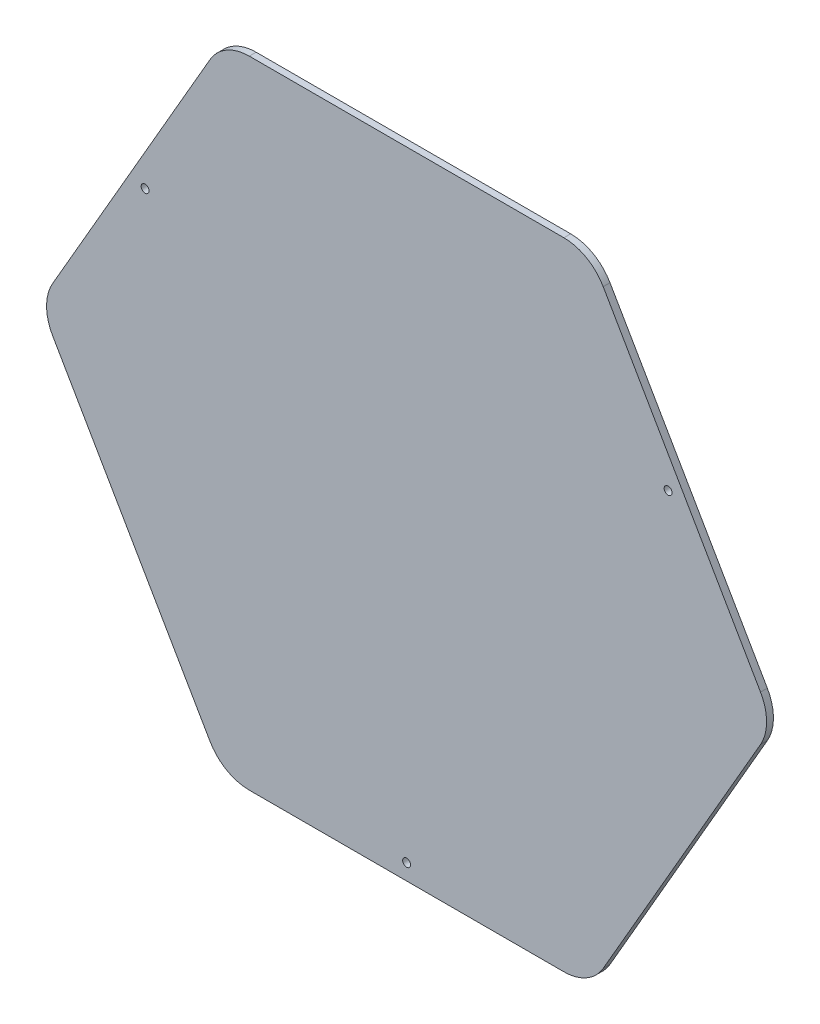
ISO-10303-21;
HEADER;
FILE_DESCRIPTION(('STEP AP214'),'2;1');
FILE_NAME('part.step','',(''),(''),'','','');
FILE_SCHEMA(('AUTOMOTIVE_DESIGN { 1 0 10303 214 1 1 1 1 }'));
ENDSEC;
DATA;
#1=APPLICATION_CONTEXT('core data for automotive mechanical design processes');
#2=APPLICATION_PROTOCOL_DEFINITION('international standard','automotive_design',2000,#1);
#3=PRODUCT_CONTEXT('',#1,'mechanical');
#4=PRODUCT('Part','Part','',(#3));
#5=PRODUCT_RELATED_PRODUCT_CATEGORY('part','',(#4));
#6=PRODUCT_DEFINITION_FORMATION('','',#4);
#7=PRODUCT_DEFINITION_CONTEXT('part definition',#1,'design');
#8=PRODUCT_DEFINITION('design','',#6,#7);
#9=PRODUCT_DEFINITION_SHAPE('','',#8);
#10=(LENGTH_UNIT() NAMED_UNIT(*) SI_UNIT(.MILLI.,.METRE.));
#11=(NAMED_UNIT(*) PLANE_ANGLE_UNIT() SI_UNIT($,.RADIAN.));
#12=(NAMED_UNIT(*) SI_UNIT($,.STERADIAN.) SOLID_ANGLE_UNIT());
#13=UNCERTAINTY_MEASURE_WITH_UNIT(LENGTH_MEASURE(1.E-05),#10,'distance_accuracy_value','');
#14=(GEOMETRIC_REPRESENTATION_CONTEXT(3) GLOBAL_UNCERTAINTY_ASSIGNED_CONTEXT((#13)) GLOBAL_UNIT_ASSIGNED_CONTEXT((#10,
#11,#12)) REPRESENTATION_CONTEXT('',''));
#15=CARTESIAN_POINT('',(0.,0.,0.));
#16=DIRECTION('',(0.,0.,1.));
#17=DIRECTION('',(1.,0.,0.));
#18=AXIS2_PLACEMENT_3D('',#15,#16,#17);
#19=CARTESIAN_POINT('',(0.,140.,3.));
#20=DIRECTION('',(0.,-1.,0.));
#21=DIRECTION('',(0.,0.,-1.));
#22=AXIS2_PLACEMENT_3D('',#19,#20,#21);
#23=PLANE('',#22);
#24=DIRECTION('',(-1.,0.,0.));
#25=VECTOR('',#24,1.);
#26=CARTESIAN_POINT('',(0.,140.,3.));
#27=LINE('',#26,#25);
#28=CARTESIAN_POINT('',(69.2820323027552,140.,3.));
#29=VERTEX_POINT('',#28);
#30=CARTESIAN_POINT('',(-69.2820323027552,140.,3.));
#31=VERTEX_POINT('',#30);
#32=EDGE_CURVE('E248',#29,#31,#27,.T.);
#33=ORIENTED_EDGE('',*,*,#32,.F.);
#34=DIRECTION('',(0.,0.,-1.));
#35=VECTOR('',#34,1.);
#36=CARTESIAN_POINT('',(69.2820323027552,140.,3.));
#37=LINE('',#36,#35);
#38=CARTESIAN_POINT('',(69.2820323027552,140.,0.));
#39=VERTEX_POINT('',#38);
#40=EDGE_CURVE('E231',#29,#39,#37,.T.);
#41=ORIENTED_EDGE('',*,*,#40,.T.);
#42=DIRECTION('',(-1.,0.,0.));
#43=VECTOR('',#42,1.);
#44=CARTESIAN_POINT('',(0.,140.,0.));
#45=LINE('',#44,#43);
#46=CARTESIAN_POINT('',(-69.2820323027552,140.,0.));
#47=VERTEX_POINT('',#46);
#48=EDGE_CURVE('E246',#39,#47,#45,.T.);
#49=ORIENTED_EDGE('',*,*,#48,.T.);
#50=DIRECTION('',(0.,0.,-1.));
#51=VECTOR('',#50,1.);
#52=CARTESIAN_POINT('',(-69.2820323027552,140.,3.));
#53=LINE('',#52,#51);
#54=EDGE_CURVE('E255',#47,#31,#53,.F.);
#55=ORIENTED_EDGE('',*,*,#54,.T.);
#56=EDGE_LOOP('',(#33,#41,#49,#55));
#57=FACE_BOUND('',#56,.T.);
#58=ADVANCED_FACE('F138',(#57),#23,.F.);
#59=CARTESIAN_POINT('',(-121.243556529821,70.,3.));
#60=DIRECTION('',(0.866025403784438,-0.5,0.));
#61=DIRECTION('',(0.5,0.866025403784439,0.));
#62=AXIS2_PLACEMENT_3D('',#59,#60,#61);
#63=PLANE('',#62);
#64=DIRECTION('',(-0.5,-0.866025403784439,0.));
#65=VECTOR('',#64,1.);
#66=CARTESIAN_POINT('',(-121.243556529821,70.,3.));
#67=LINE('',#66,#65);
#68=CARTESIAN_POINT('',(-86.6025403784439,130.,3.));
#69=VERTEX_POINT('',#68);
#70=CARTESIAN_POINT('',(-155.884572681199,10.0000000000001,3.));
#71=VERTEX_POINT('',#70);
#72=EDGE_CURVE('E350',#69,#71,#67,.T.);
#73=ORIENTED_EDGE('',*,*,#72,.F.);
#74=DIRECTION('',(0.,0.,-1.));
#75=VECTOR('',#74,1.);
#76=CARTESIAN_POINT('',(-86.6025403784439,130.,3.));
#77=LINE('',#76,#75);
#78=CARTESIAN_POINT('',(-86.6025403784439,130.,0.));
#79=VERTEX_POINT('',#78);
#80=EDGE_CURVE('E324',#69,#79,#77,.T.);
#81=ORIENTED_EDGE('',*,*,#80,.T.);
#82=DIRECTION('',(-0.5,-0.866025403784439,0.));
#83=VECTOR('',#82,1.);
#84=CARTESIAN_POINT('',(-121.243556529821,70.,0.));
#85=LINE('',#84,#83);
#86=CARTESIAN_POINT('',(-155.884572681199,10.0000000000001,0.));
#87=VERTEX_POINT('',#86);
#88=EDGE_CURVE('E256',#79,#87,#85,.T.);
#89=ORIENTED_EDGE('',*,*,#88,.T.);
#90=DIRECTION('',(0.,0.,-1.));
#91=VECTOR('',#90,1.);
#92=CARTESIAN_POINT('',(-155.884572681199,10.0000000000001,3.));
#93=LINE('',#92,#91);
#94=EDGE_CURVE('E319',#87,#71,#93,.F.);
#95=ORIENTED_EDGE('',*,*,#94,.T.);
#96=EDGE_LOOP('',(#73,#81,#89,#95));
#97=FACE_BOUND('',#96,.T.);
#98=ADVANCED_FACE('F417',(#97),#63,.F.);
#99=CARTESIAN_POINT('',(-121.243556529821,-70.,3.));
#100=DIRECTION('',(0.866025403784439,0.5,0.));
#101=DIRECTION('',(-0.5,0.866025403784439,0.));
#102=AXIS2_PLACEMENT_3D('',#99,#100,#101);
#103=PLANE('',#102);
#104=DIRECTION('',(0.5,-0.866025403784439,0.));
#105=VECTOR('',#104,1.);
#106=CARTESIAN_POINT('',(-121.243556529821,-70.,3.));
#107=LINE('',#106,#105);
#108=CARTESIAN_POINT('',(-155.884572681199,-9.99999999999993,3.));
#109=VERTEX_POINT('',#108);
#110=CARTESIAN_POINT('',(-86.6025403784439,-130.,3.));
#111=VERTEX_POINT('',#110);
#112=EDGE_CURVE('E345',#109,#111,#107,.T.);
#113=ORIENTED_EDGE('',*,*,#112,.F.);
#114=DIRECTION('',(0.,0.,-1.));
#115=VECTOR('',#114,1.);
#116=CARTESIAN_POINT('',(-155.884572681199,-9.99999999999995,3.));
#117=LINE('',#116,#115);
#118=CARTESIAN_POINT('',(-155.884572681199,-9.99999999999993,0.));
#119=VERTEX_POINT('',#118);
#120=EDGE_CURVE('E328',#109,#119,#117,.T.);
#121=ORIENTED_EDGE('',*,*,#120,.T.);
#122=DIRECTION('',(0.5,-0.866025403784439,0.));
#123=VECTOR('',#122,1.);
#124=CARTESIAN_POINT('',(-121.243556529821,-70.,0.));
#125=LINE('',#124,#123);
#126=CARTESIAN_POINT('',(-86.6025403784439,-130.,0.));
#127=VERTEX_POINT('',#126);
#128=EDGE_CURVE('E263',#119,#127,#125,.T.);
#129=ORIENTED_EDGE('',*,*,#128,.T.);
#130=DIRECTION('',(0.,0.,-1.));
#131=VECTOR('',#130,1.);
#132=CARTESIAN_POINT('',(-86.6025403784439,-130.,3.));
#133=LINE('',#132,#131);
#134=EDGE_CURVE('E322',#127,#111,#133,.F.);
#135=ORIENTED_EDGE('',*,*,#134,.T.);
#136=EDGE_LOOP('',(#113,#121,#129,#135));
#137=FACE_BOUND('',#136,.T.);
#138=ADVANCED_FACE('F423',(#137),#103,.F.);
#139=CARTESIAN_POINT('',(0.,-140.,3.));
#140=DIRECTION('',(0.,1.,0.));
#141=DIRECTION('',(-1.,0.,0.));
#142=AXIS2_PLACEMENT_3D('',#139,#140,#141);
#143=PLANE('',#142);
#144=DIRECTION('',(1.,0.,0.));
#145=VECTOR('',#144,1.);
#146=CARTESIAN_POINT('',(0.,-140.,3.));
#147=LINE('',#146,#145);
#148=CARTESIAN_POINT('',(-69.2820323027551,-140.,3.));
#149=VERTEX_POINT('',#148);
#150=CARTESIAN_POINT('',(69.2820323027551,-140.,3.));
#151=VERTEX_POINT('',#150);
#152=EDGE_CURVE('E344',#149,#151,#147,.T.);
#153=ORIENTED_EDGE('',*,*,#152,.F.);
#154=DIRECTION('',(0.,0.,-1.));
#155=VECTOR('',#154,1.);
#156=CARTESIAN_POINT('',(-69.2820323027551,-140.,3.));
#157=LINE('',#156,#155);
#158=CARTESIAN_POINT('',(-69.2820323027551,-140.,0.));
#159=VERTEX_POINT('',#158);
#160=EDGE_CURVE('E331',#149,#159,#157,.T.);
#161=ORIENTED_EDGE('',*,*,#160,.T.);
#162=DIRECTION('',(1.,0.,0.));
#163=VECTOR('',#162,1.);
#164=CARTESIAN_POINT('',(0.,-140.,0.));
#165=LINE('',#164,#163);
#166=CARTESIAN_POINT('',(69.2820323027551,-140.,0.));
#167=VERTEX_POINT('',#166);
#168=EDGE_CURVE('E275',#159,#167,#165,.T.);
#169=ORIENTED_EDGE('',*,*,#168,.T.);
#170=DIRECTION('',(0.,0.,-1.));
#171=VECTOR('',#170,1.);
#172=CARTESIAN_POINT('',(69.2820323027551,-140.,3.));
#173=LINE('',#172,#171);
#174=EDGE_CURVE('E335',#167,#151,#173,.F.);
#175=ORIENTED_EDGE('',*,*,#174,.T.);
#176=EDGE_LOOP('',(#153,#161,#169,#175));
#177=FACE_BOUND('',#176,.T.);
#178=ADVANCED_FACE('F458',(#177),#143,.F.);
#179=CARTESIAN_POINT('',(121.243556529821,-69.9999999999999,3.));
#180=DIRECTION('',(-0.866025403784439,0.5,0.));
#181=DIRECTION('',(-0.5,-0.866025403784439,0.));
#182=AXIS2_PLACEMENT_3D('',#179,#180,#181);
#183=PLANE('',#182);
#184=DIRECTION('',(0.5,0.866025403784439,0.));
#185=VECTOR('',#184,1.);
#186=CARTESIAN_POINT('',(121.243556529821,-69.9999999999999,3.));
#187=LINE('',#186,#185);
#188=CARTESIAN_POINT('',(86.6025403784438,-130.,3.));
#189=VERTEX_POINT('',#188);
#190=CARTESIAN_POINT('',(155.884572681199,-9.99999999999984,3.));
#191=VERTEX_POINT('',#190);
#192=EDGE_CURVE('E281',#189,#191,#187,.T.);
#193=ORIENTED_EDGE('',*,*,#192,.F.);
#194=DIRECTION('',(0.,0.,-1.));
#195=VECTOR('',#194,1.);
#196=CARTESIAN_POINT('',(86.6025403784438,-130.,3.));
#197=LINE('',#196,#195);
#198=CARTESIAN_POINT('',(86.6025403784438,-130.,0.));
#199=VERTEX_POINT('',#198);
#200=EDGE_CURVE('E12',#189,#199,#197,.T.);
#201=ORIENTED_EDGE('',*,*,#200,.T.);
#202=DIRECTION('',(0.5,0.866025403784439,0.));
#203=VECTOR('',#202,1.);
#204=CARTESIAN_POINT('',(121.243556529821,-69.9999999999999,0.));
#205=LINE('',#204,#203);
#206=CARTESIAN_POINT('',(155.884572681199,-9.99999999999984,0.));
#207=VERTEX_POINT('',#206);
#208=EDGE_CURVE('E279',#199,#207,#205,.T.);
#209=ORIENTED_EDGE('',*,*,#208,.T.);
#210=DIRECTION('',(0.,0.,-1.));
#211=VECTOR('',#210,1.);
#212=CARTESIAN_POINT('',(155.884572681199,-9.99999999999986,3.));
#213=LINE('',#212,#211);
#214=EDGE_CURVE('E146',#207,#191,#213,.F.);
#215=ORIENTED_EDGE('',*,*,#214,.T.);
#216=EDGE_LOOP('',(#193,#201,#209,#215));
#217=FACE_BOUND('',#216,.T.);
#218=ADVANCED_FACE('F426',(#217),#183,.F.);
#219=CARTESIAN_POINT('',(121.243556529821,70.,3.));
#220=DIRECTION('',(-0.866025403784439,-0.5,0.));
#221=DIRECTION('',(0.5,-0.866025403784439,0.));
#222=AXIS2_PLACEMENT_3D('',#219,#220,#221);
#223=PLANE('',#222);
#224=DIRECTION('',(-0.5,0.866025403784439,0.));
#225=VECTOR('',#224,1.);
#226=CARTESIAN_POINT('',(121.243556529821,70.,0.));
#227=LINE('',#226,#225);
#228=CARTESIAN_POINT('',(155.884572681199,10.0000000000001,0.));
#229=VERTEX_POINT('',#228);
#230=CARTESIAN_POINT('',(86.6025403784439,130.,0.));
#231=VERTEX_POINT('',#230);
#232=EDGE_CURVE('E260',#229,#231,#227,.T.);
#233=ORIENTED_EDGE('',*,*,#232,.T.);
#234=DIRECTION('',(0.,0.,-1.));
#235=VECTOR('',#234,1.);
#236=CARTESIAN_POINT('',(86.6025403784439,130.,3.));
#237=LINE('',#236,#235);
#238=CARTESIAN_POINT('',(86.6025403784439,130.,3.));
#239=VERTEX_POINT('',#238);
#240=EDGE_CURVE('E234',#231,#239,#237,.F.);
#241=ORIENTED_EDGE('',*,*,#240,.T.);
#242=DIRECTION('',(-0.5,0.866025403784439,0.));
#243=VECTOR('',#242,1.);
#244=CARTESIAN_POINT('',(121.243556529821,70.,3.));
#245=LINE('',#244,#243);
#246=CARTESIAN_POINT('',(155.884572681199,10.0000000000001,3.));
#247=VERTEX_POINT('',#246);
#248=EDGE_CURVE('E278',#247,#239,#245,.T.);
#249=ORIENTED_EDGE('',*,*,#248,.F.);
#250=DIRECTION('',(0.,0.,-1.));
#251=VECTOR('',#250,1.);
#252=CARTESIAN_POINT('',(155.884572681199,10.0000000000001,3.));
#253=LINE('',#252,#251);
#254=EDGE_CURVE('E239',#247,#229,#253,.T.);
#255=ORIENTED_EDGE('',*,*,#254,.T.);
#256=EDGE_LOOP('',(#233,#241,#249,#255));
#257=FACE_BOUND('',#256,.T.);
#258=ADVANCED_FACE('F392',(#257),#223,.F.);
#259=CARTESIAN_POINT('',(0.,0.,0.));
#260=DIRECTION('',(0.,0.,1.));
#261=DIRECTION('',(1.,0.,0.));
#262=AXIS2_PLACEMENT_3D('',#259,#260,#261);
#263=PLANE('',#262);
#264=CARTESIAN_POINT('',(1.35444719101713E-12,-133.,0.));
#265=DIRECTION('',(0.,0.,-1.));
#266=DIRECTION('',(-1.,0.,0.));
#267=AXIS2_PLACEMENT_3D('',#264,#265,#266);
#268=CIRCLE('',#267,1.75000000000002);
#269=CARTESIAN_POINT('',(-1.74999999999867,-133.,0.));
#270=VERTEX_POINT('',#269);
#271=EDGE_CURVE('E372',#270,#270,#268,.T.);
#272=ORIENTED_EDGE('',*,*,#271,.F.);
#273=EDGE_LOOP('',(#272));
#274=FACE_BOUND('',#273,.T.);
#275=CARTESIAN_POINT('',(115.181378703329,66.5000000000017,0.));
#276=DIRECTION('',(0.,0.,-1.));
#277=DIRECTION('',(-1.,0.,0.));
#278=AXIS2_PLACEMENT_3D('',#275,#276,#277);
#279=CIRCLE('',#278,1.75000000000003);
#280=CARTESIAN_POINT('',(113.431378703329,66.5000000000017,0.));
#281=VERTEX_POINT('',#280);
#282=EDGE_CURVE('E369',#281,#281,#279,.T.);
#283=ORIENTED_EDGE('',*,*,#282,.F.);
#284=EDGE_LOOP('',(#283));
#285=FACE_BOUND('',#284,.T.);
#286=CARTESIAN_POINT('',(-115.181378703332,66.4999999999978,0.));
#287=DIRECTION('',(0.,0.,-1.));
#288=DIRECTION('',(-1.,0.,0.));
#289=AXIS2_PLACEMENT_3D('',#286,#287,#288);
#290=CIRCLE('',#289,1.75000000000001);
#291=CARTESIAN_POINT('',(-116.931378703332,66.4999999999978,0.));
#292=VERTEX_POINT('',#291);
#293=EDGE_CURVE('E365',#292,#292,#290,.T.);
#294=ORIENTED_EDGE('',*,*,#293,.F.);
#295=EDGE_LOOP('',(#294));
#296=FACE_BOUND('',#295,.T.);
#297=ORIENTED_EDGE('',*,*,#48,.F.);
#298=CARTESIAN_POINT('',(69.2820323027552,120.,0.));
#299=DIRECTION('',(0.,0.,1.));
#300=DIRECTION('',(1.,0.,0.));
#301=AXIS2_PLACEMENT_3D('',#298,#299,#300);
#302=CIRCLE('',#301,20.);
#303=EDGE_CURVE('E230',#39,#231,#302,.F.);
#304=ORIENTED_EDGE('',*,*,#303,.T.);
#305=ORIENTED_EDGE('',*,*,#232,.F.);
#306=CARTESIAN_POINT('',(138.56406460551,1.38777878078145E-13,0.));
#307=DIRECTION('',(0.,0.,1.));
#308=DIRECTION('',(1.,0.,0.));
#309=AXIS2_PLACEMENT_3D('',#306,#307,#308);
#310=CIRCLE('',#309,20.);
#311=EDGE_CURVE('E252',#229,#207,#310,.F.);
#312=ORIENTED_EDGE('',*,*,#311,.T.);
#313=ORIENTED_EDGE('',*,*,#208,.F.);
#314=CARTESIAN_POINT('',(69.2820323027551,-120.,0.));
#315=DIRECTION('',(0.,0.,1.));
#316=DIRECTION('',(1.,0.,0.));
#317=AXIS2_PLACEMENT_3D('',#314,#315,#316);
#318=CIRCLE('',#317,20.);
#319=EDGE_CURVE('E284',#199,#167,#318,.F.);
#320=ORIENTED_EDGE('',*,*,#319,.T.);
#321=ORIENTED_EDGE('',*,*,#168,.F.);
#322=CARTESIAN_POINT('',(-69.2820323027551,-120.,0.));
#323=DIRECTION('',(0.,0.,1.));
#324=DIRECTION('',(1.,0.,0.));
#325=AXIS2_PLACEMENT_3D('',#322,#323,#324);
#326=CIRCLE('',#325,20.);
#327=EDGE_CURVE('E288',#159,#127,#326,.F.);
#328=ORIENTED_EDGE('',*,*,#327,.T.);
#329=ORIENTED_EDGE('',*,*,#128,.F.);
#330=CARTESIAN_POINT('',(-138.56406460551,0.,0.));
#331=DIRECTION('',(0.,0.,1.));
#332=DIRECTION('',(1.,0.,0.));
#333=AXIS2_PLACEMENT_3D('',#330,#331,#332);
#334=CIRCLE('',#333,20.);
#335=EDGE_CURVE('E293',#119,#87,#334,.F.);
#336=ORIENTED_EDGE('',*,*,#335,.T.);
#337=ORIENTED_EDGE('',*,*,#88,.F.);
#338=CARTESIAN_POINT('',(-69.2820323027552,120.,0.));
#339=DIRECTION('',(0.,0.,1.));
#340=DIRECTION('',(1.,0.,0.));
#341=AXIS2_PLACEMENT_3D('',#338,#339,#340);
#342=CIRCLE('',#341,20.);
#343=EDGE_CURVE('E241',#79,#47,#342,.F.);
#344=ORIENTED_EDGE('',*,*,#343,.T.);
#345=EDGE_LOOP('',(#297,#304,#305,#312,#313,#320,#321,#328,#329,#336,#337,#344));
#346=FACE_BOUND('',#345,.T.);
#347=ADVANCED_FACE('F251',(#274,#285,#296,#346),#263,.F.);
#348=CARTESIAN_POINT('',(0.,0.,3.));
#349=DIRECTION('',(0.,0.,1.));
#350=DIRECTION('',(1.,0.,0.));
#351=AXIS2_PLACEMENT_3D('',#348,#349,#350);
#352=PLANE('',#351);
#353=CARTESIAN_POINT('',(1.35444719101713E-12,-133.,3.));
#354=DIRECTION('',(0.,0.,-1.));
#355=DIRECTION('',(-1.,0.,0.));
#356=AXIS2_PLACEMENT_3D('',#353,#354,#355);
#357=CIRCLE('',#356,1.75000000000002);
#358=CARTESIAN_POINT('',(-1.74999999999867,-133.,3.));
#359=VERTEX_POINT('',#358);
#360=EDGE_CURVE('E264',#359,#359,#357,.T.);
#361=ORIENTED_EDGE('',*,*,#360,.T.);
#362=EDGE_LOOP('',(#361));
#363=FACE_BOUND('',#362,.T.);
#364=CARTESIAN_POINT('',(115.181378703329,66.5000000000017,3.));
#365=DIRECTION('',(0.,0.,-1.));
#366=DIRECTION('',(-1.,0.,0.));
#367=AXIS2_PLACEMENT_3D('',#364,#365,#366);
#368=CIRCLE('',#367,1.75000000000003);
#369=CARTESIAN_POINT('',(113.431378703329,66.5000000000017,3.));
#370=VERTEX_POINT('',#369);
#371=EDGE_CURVE('E366',#370,#370,#368,.T.);
#372=ORIENTED_EDGE('',*,*,#371,.T.);
#373=EDGE_LOOP('',(#372));
#374=FACE_BOUND('',#373,.T.);
#375=CARTESIAN_POINT('',(-115.181378703332,66.4999999999978,3.));
#376=DIRECTION('',(0.,0.,-1.));
#377=DIRECTION('',(-1.,0.,0.));
#378=AXIS2_PLACEMENT_3D('',#375,#376,#377);
#379=CIRCLE('',#378,1.75000000000001);
#380=CARTESIAN_POINT('',(-116.931378703332,66.4999999999978,3.));
#381=VERTEX_POINT('',#380);
#382=EDGE_CURVE('E356',#381,#381,#379,.T.);
#383=ORIENTED_EDGE('',*,*,#382,.T.);
#384=EDGE_LOOP('',(#383));
#385=FACE_BOUND('',#384,.T.);
#386=ORIENTED_EDGE('',*,*,#248,.T.);
#387=CARTESIAN_POINT('',(69.2820323027552,120.,3.));
#388=DIRECTION('',(0.,0.,1.));
#389=DIRECTION('',(1.,0.,0.));
#390=AXIS2_PLACEMENT_3D('',#387,#388,#389);
#391=CIRCLE('',#390,20.);
#392=EDGE_CURVE('E314',#239,#29,#391,.T.);
#393=ORIENTED_EDGE('',*,*,#392,.T.);
#394=ORIENTED_EDGE('',*,*,#32,.T.);
#395=CARTESIAN_POINT('',(-69.2820323027552,120.,3.));
#396=DIRECTION('',(0.,0.,1.));
#397=DIRECTION('',(1.,0.,0.));
#398=AXIS2_PLACEMENT_3D('',#395,#396,#397);
#399=CIRCLE('',#398,20.);
#400=EDGE_CURVE('E315',#31,#69,#399,.T.);
#401=ORIENTED_EDGE('',*,*,#400,.T.);
#402=ORIENTED_EDGE('',*,*,#72,.T.);
#403=CARTESIAN_POINT('',(-138.56406460551,0.,3.));
#404=DIRECTION('',(0.,0.,1.));
#405=DIRECTION('',(1.,0.,0.));
#406=AXIS2_PLACEMENT_3D('',#403,#404,#405);
#407=CIRCLE('',#406,20.);
#408=EDGE_CURVE('E307',#71,#109,#407,.T.);
#409=ORIENTED_EDGE('',*,*,#408,.T.);
#410=ORIENTED_EDGE('',*,*,#112,.T.);
#411=CARTESIAN_POINT('',(-69.2820323027551,-120.,3.));
#412=DIRECTION('',(0.,0.,1.));
#413=DIRECTION('',(1.,0.,0.));
#414=AXIS2_PLACEMENT_3D('',#411,#412,#413);
#415=CIRCLE('',#414,20.);
#416=EDGE_CURVE('E306',#111,#149,#415,.T.);
#417=ORIENTED_EDGE('',*,*,#416,.T.);
#418=ORIENTED_EDGE('',*,*,#152,.T.);
#419=CARTESIAN_POINT('',(69.2820323027551,-120.,3.));
#420=DIRECTION('',(0.,0.,1.));
#421=DIRECTION('',(1.,0.,0.));
#422=AXIS2_PLACEMENT_3D('',#419,#420,#421);
#423=CIRCLE('',#422,20.);
#424=EDGE_CURVE('E156',#151,#189,#423,.T.);
#425=ORIENTED_EDGE('',*,*,#424,.T.);
#426=ORIENTED_EDGE('',*,*,#192,.T.);
#427=CARTESIAN_POINT('',(138.56406460551,1.38777878078145E-13,3.));
#428=DIRECTION('',(0.,0.,1.));
#429=DIRECTION('',(1.,0.,0.));
#430=AXIS2_PLACEMENT_3D('',#427,#428,#429);
#431=CIRCLE('',#430,20.);
#432=EDGE_CURVE('E301',#191,#247,#431,.T.);
#433=ORIENTED_EDGE('',*,*,#432,.T.);
#434=EDGE_LOOP('',(#386,#393,#394,#401,#402,#409,#410,#417,#418,#425,#426,#433));
#435=FACE_BOUND('',#434,.T.);
#436=ADVANCED_FACE('F385',(#363,#374,#385,#435),#352,.T.);
#437=CARTESIAN_POINT('',(69.2820323027552,120.,3.));
#438=DIRECTION('',(0.,0.,-1.));
#439=DIRECTION('',(-1.,0.,0.));
#440=AXIS2_PLACEMENT_3D('',#437,#438,#439);
#441=CYLINDRICAL_SURFACE('',#440,20.);
#442=ORIENTED_EDGE('',*,*,#392,.F.);
#443=ORIENTED_EDGE('',*,*,#240,.F.);
#444=ORIENTED_EDGE('',*,*,#303,.F.);
#445=ORIENTED_EDGE('',*,*,#40,.F.);
#446=EDGE_LOOP('',(#442,#443,#444,#445));
#447=FACE_BOUND('',#446,.T.);
#448=ADVANCED_FACE('F235',(#447),#441,.T.);
#449=CARTESIAN_POINT('',(-69.2820323027552,120.,3.));
#450=DIRECTION('',(0.,0.,-1.));
#451=DIRECTION('',(-1.,0.,0.));
#452=AXIS2_PLACEMENT_3D('',#449,#450,#451);
#453=CYLINDRICAL_SURFACE('',#452,20.);
#454=ORIENTED_EDGE('',*,*,#400,.F.);
#455=ORIENTED_EDGE('',*,*,#54,.F.);
#456=ORIENTED_EDGE('',*,*,#343,.F.);
#457=ORIENTED_EDGE('',*,*,#80,.F.);
#458=EDGE_LOOP('',(#454,#455,#456,#457));
#459=FACE_BOUND('',#458,.T.);
#460=ADVANCED_FACE('F435',(#459),#453,.T.);
#461=CARTESIAN_POINT('',(-138.56406460551,0.,3.));
#462=DIRECTION('',(0.,0.,-1.));
#463=DIRECTION('',(-1.,0.,0.));
#464=AXIS2_PLACEMENT_3D('',#461,#462,#463);
#465=CYLINDRICAL_SURFACE('',#464,20.);
#466=ORIENTED_EDGE('',*,*,#408,.F.);
#467=ORIENTED_EDGE('',*,*,#94,.F.);
#468=ORIENTED_EDGE('',*,*,#335,.F.);
#469=ORIENTED_EDGE('',*,*,#120,.F.);
#470=EDGE_LOOP('',(#466,#467,#468,#469));
#471=FACE_BOUND('',#470,.T.);
#472=ADVANCED_FACE('F434',(#471),#465,.T.);
#473=CARTESIAN_POINT('',(-69.2820323027551,-120.,3.));
#474=DIRECTION('',(0.,0.,-1.));
#475=DIRECTION('',(-1.,0.,0.));
#476=AXIS2_PLACEMENT_3D('',#473,#474,#475);
#477=CYLINDRICAL_SURFACE('',#476,20.);
#478=ORIENTED_EDGE('',*,*,#416,.F.);
#479=ORIENTED_EDGE('',*,*,#134,.F.);
#480=ORIENTED_EDGE('',*,*,#327,.F.);
#481=ORIENTED_EDGE('',*,*,#160,.F.);
#482=EDGE_LOOP('',(#478,#479,#480,#481));
#483=FACE_BOUND('',#482,.T.);
#484=ADVANCED_FACE('F437',(#483),#477,.T.);
#485=CARTESIAN_POINT('',(69.2820323027551,-120.,3.));
#486=DIRECTION('',(0.,0.,-1.));
#487=DIRECTION('',(-1.,0.,0.));
#488=AXIS2_PLACEMENT_3D('',#485,#486,#487);
#489=CYLINDRICAL_SURFACE('',#488,20.);
#490=ORIENTED_EDGE('',*,*,#424,.F.);
#491=ORIENTED_EDGE('',*,*,#174,.F.);
#492=ORIENTED_EDGE('',*,*,#319,.F.);
#493=ORIENTED_EDGE('',*,*,#200,.F.);
#494=EDGE_LOOP('',(#490,#491,#492,#493));
#495=FACE_BOUND('',#494,.T.);
#496=ADVANCED_FACE('F411',(#495),#489,.T.);
#497=CARTESIAN_POINT('',(138.56406460551,1.38777878078145E-13,3.));
#498=DIRECTION('',(0.,0.,-1.));
#499=DIRECTION('',(-1.,0.,0.));
#500=AXIS2_PLACEMENT_3D('',#497,#498,#499);
#501=CYLINDRICAL_SURFACE('',#500,20.);
#502=ORIENTED_EDGE('',*,*,#432,.F.);
#503=ORIENTED_EDGE('',*,*,#214,.F.);
#504=ORIENTED_EDGE('',*,*,#311,.F.);
#505=ORIENTED_EDGE('',*,*,#254,.F.);
#506=EDGE_LOOP('',(#502,#503,#504,#505));
#507=FACE_BOUND('',#506,.T.);
#508=ADVANCED_FACE('F136',(#507),#501,.T.);
#509=CARTESIAN_POINT('',(-115.181378703332,66.4999999999978,3.));
#510=DIRECTION('',(0.,0.,-1.));
#511=DIRECTION('',(-1.,0.,0.));
#512=AXIS2_PLACEMENT_3D('',#509,#510,#511);
#513=CYLINDRICAL_SURFACE('',#512,1.75000000000001);
#514=ORIENTED_EDGE('',*,*,#382,.F.);
#515=EDGE_LOOP('',(#514));
#516=FACE_BOUND('',#515,.T.);
#517=ORIENTED_EDGE('',*,*,#293,.T.);
#518=EDGE_LOOP('',(#517));
#519=FACE_BOUND('',#518,.T.);
#520=ADVANCED_FACE('F396',(#516,#519),#513,.F.);
#521=CARTESIAN_POINT('',(115.181378703329,66.5000000000017,3.));
#522=DIRECTION('',(0.,0.,-1.));
#523=DIRECTION('',(-1.,0.,0.));
#524=AXIS2_PLACEMENT_3D('',#521,#522,#523);
#525=CYLINDRICAL_SURFACE('',#524,1.75000000000003);
#526=ORIENTED_EDGE('',*,*,#371,.F.);
#527=EDGE_LOOP('',(#526));
#528=FACE_BOUND('',#527,.T.);
#529=ORIENTED_EDGE('',*,*,#282,.T.);
#530=EDGE_LOOP('',(#529));
#531=FACE_BOUND('',#530,.T.);
#532=ADVANCED_FACE('F390',(#528,#531),#525,.F.);
#533=CARTESIAN_POINT('',(1.35444719101713E-12,-133.,3.));
#534=DIRECTION('',(0.,0.,-1.));
#535=DIRECTION('',(-1.,0.,0.));
#536=AXIS2_PLACEMENT_3D('',#533,#534,#535);
#537=CYLINDRICAL_SURFACE('',#536,1.75000000000002);
#538=ORIENTED_EDGE('',*,*,#360,.F.);
#539=EDGE_LOOP('',(#538));
#540=FACE_BOUND('',#539,.T.);
#541=ORIENTED_EDGE('',*,*,#271,.T.);
#542=EDGE_LOOP('',(#541));
#543=FACE_BOUND('',#542,.T.);
#544=ADVANCED_FACE('F383',(#540,#543),#537,.F.);
#545=CLOSED_SHELL('',(#58,#98,#138,#178,#218,#258,#347,#436,#448,#460,#472,#484,#496,#508,#520,
#532,#544));
#546=MANIFOLD_SOLID_BREP('B2',#545);
#547=ADVANCED_BREP_SHAPE_REPRESENTATION('',(#18,#546),#14);
#548=SHAPE_DEFINITION_REPRESENTATION(#9,#547);
ENDSEC;
END-ISO-10303-21;
